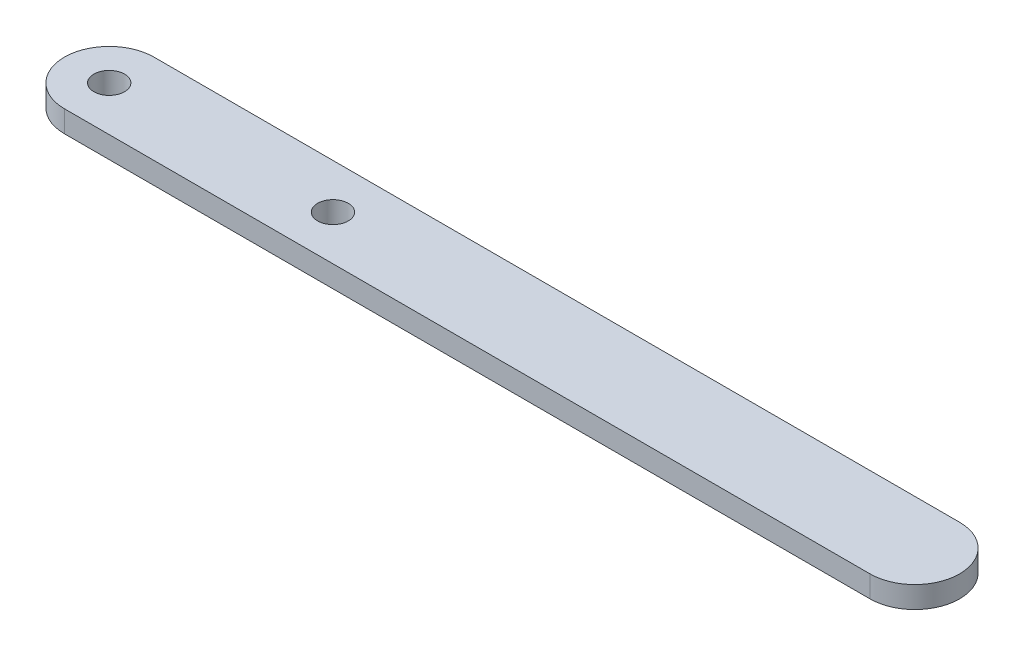
ISO-10303-21;
HEADER;
FILE_DESCRIPTION(('STEP AP214'),'2;1');
FILE_NAME('part.step','',(''),(''),'','','');
FILE_SCHEMA(('AUTOMOTIVE_DESIGN { 1 0 10303 214 1 1 1 1 }'));
ENDSEC;
DATA;
#1=APPLICATION_CONTEXT('core data for automotive mechanical design processes');
#2=APPLICATION_PROTOCOL_DEFINITION('international standard','automotive_design',2000,#1);
#3=PRODUCT_CONTEXT('',#1,'mechanical');
#4=PRODUCT('Part','Part','',(#3));
#5=PRODUCT_RELATED_PRODUCT_CATEGORY('part','',(#4));
#6=PRODUCT_DEFINITION_FORMATION('','',#4);
#7=PRODUCT_DEFINITION_CONTEXT('part definition',#1,'design');
#8=PRODUCT_DEFINITION('design','',#6,#7);
#9=PRODUCT_DEFINITION_SHAPE('','',#8);
#10=(LENGTH_UNIT() NAMED_UNIT(*) SI_UNIT(.MILLI.,.METRE.));
#11=(NAMED_UNIT(*) PLANE_ANGLE_UNIT() SI_UNIT($,.RADIAN.));
#12=(NAMED_UNIT(*) SI_UNIT($,.STERADIAN.) SOLID_ANGLE_UNIT());
#13=UNCERTAINTY_MEASURE_WITH_UNIT(LENGTH_MEASURE(1.E-05),#10,'distance_accuracy_value','');
#14=(GEOMETRIC_REPRESENTATION_CONTEXT(3) GLOBAL_UNCERTAINTY_ASSIGNED_CONTEXT((#13)) GLOBAL_UNIT_ASSIGNED_CONTEXT((#10,
#11,#12)) REPRESENTATION_CONTEXT('',''));
#15=CARTESIAN_POINT('',(0.,0.,0.));
#16=DIRECTION('',(0.,0.,1.));
#17=DIRECTION('',(1.,0.,0.));
#18=AXIS2_PLACEMENT_3D('',#15,#16,#17);
#19=CARTESIAN_POINT('',(-100.944661921708,3.075,-2.35017793594306));
#20=DIRECTION('',(0.,-1.,0.));
#21=DIRECTION('',(0.,0.,-1.));
#22=AXIS2_PLACEMENT_3D('',#19,#20,#21);
#23=CYLINDRICAL_SURFACE('',#22,6.35);
#24=CARTESIAN_POINT('',(-100.944661921708,0.,-2.35017793594306));
#25=DIRECTION('',(0.,1.,0.));
#26=DIRECTION('',(0.,0.,1.));
#27=AXIS2_PLACEMENT_3D('',#24,#25,#26);
#28=CIRCLE('',#27,6.35);
#29=CARTESIAN_POINT('',(-100.944661921708,0.,-8.70017793594306));
#30=VERTEX_POINT('',#29);
#31=CARTESIAN_POINT('',(-100.944661921708,0.,3.99982206405694));
#32=VERTEX_POINT('',#31);
#33=EDGE_CURVE('E113',#30,#32,#28,.T.);
#34=ORIENTED_EDGE('',*,*,#33,.T.);
#35=DIRECTION('',(0.,-1.,0.));
#36=VECTOR('',#35,1.);
#37=CARTESIAN_POINT('',(-100.944661921708,3.075,3.99982206405694));
#38=LINE('',#37,#36);
#39=CARTESIAN_POINT('',(-100.944661921708,3.075,3.99982206405694));
#40=VERTEX_POINT('',#39);
#41=EDGE_CURVE('E11',#40,#32,#38,.T.);
#42=ORIENTED_EDGE('',*,*,#41,.F.);
#43=CARTESIAN_POINT('',(-100.944661921708,3.075,-2.35017793594306));
#44=DIRECTION('',(0.,1.,0.));
#45=DIRECTION('',(0.,0.,1.));
#46=AXIS2_PLACEMENT_3D('',#43,#44,#45);
#47=CIRCLE('',#46,6.35);
#48=CARTESIAN_POINT('',(-100.944661921708,3.075,-8.70017793594306));
#49=VERTEX_POINT('',#48);
#50=EDGE_CURVE('E96',#49,#40,#47,.T.);
#51=ORIENTED_EDGE('',*,*,#50,.F.);
#52=DIRECTION('',(0.,-1.,0.));
#53=VECTOR('',#52,1.);
#54=CARTESIAN_POINT('',(-100.944661921708,3.075,-8.70017793594306));
#55=LINE('',#54,#53);
#56=EDGE_CURVE('E109',#49,#30,#55,.T.);
#57=ORIENTED_EDGE('',*,*,#56,.T.);
#58=EDGE_LOOP('',(#34,#42,#51,#57));
#59=FACE_BOUND('',#58,.T.);
#60=ADVANCED_FACE('F42',(#59),#23,.T.);
#61=CARTESIAN_POINT('',(-100.944661921708,3.075,3.99982206405694));
#62=DIRECTION('',(0.,0.,-1.));
#63=DIRECTION('',(-1.,0.,0.));
#64=AXIS2_PLACEMENT_3D('',#61,#62,#63);
#65=PLANE('',#64);
#66=DIRECTION('',(1.,0.,0.));
#67=VECTOR('',#66,1.);
#68=CARTESIAN_POINT('',(-100.944661921708,0.,3.99982206405694));
#69=LINE('',#68,#67);
#70=CARTESIAN_POINT('',(13.3553380782918,0.,3.99982206405694));
#71=VERTEX_POINT('',#70);
#72=EDGE_CURVE('E101',#32,#71,#69,.T.);
#73=ORIENTED_EDGE('',*,*,#72,.T.);
#74=DIRECTION('',(0.,-1.,0.));
#75=VECTOR('',#74,1.);
#76=CARTESIAN_POINT('',(13.3553380782918,3.075,3.99982206405694));
#77=LINE('',#76,#75);
#78=CARTESIAN_POINT('',(13.3553380782918,3.075,3.99982206405694));
#79=VERTEX_POINT('',#78);
#80=EDGE_CURVE('E52',#79,#71,#77,.T.);
#81=ORIENTED_EDGE('',*,*,#80,.F.);
#82=DIRECTION('',(1.,0.,0.));
#83=VECTOR('',#82,1.);
#84=CARTESIAN_POINT('',(-100.944661921708,3.075,3.99982206405694));
#85=LINE('',#84,#83);
#86=EDGE_CURVE('E91',#40,#79,#85,.T.);
#87=ORIENTED_EDGE('',*,*,#86,.F.);
#88=ORIENTED_EDGE('',*,*,#41,.T.);
#89=EDGE_LOOP('',(#73,#81,#87,#88));
#90=FACE_BOUND('',#89,.T.);
#91=ADVANCED_FACE('F100',(#90),#65,.F.);
#92=CARTESIAN_POINT('',(13.3553380782918,3.075,-2.35017793594306));
#93=DIRECTION('',(0.,-1.,0.));
#94=DIRECTION('',(0.,0.,-1.));
#95=AXIS2_PLACEMENT_3D('',#92,#93,#94);
#96=CYLINDRICAL_SURFACE('',#95,6.35);
#97=CARTESIAN_POINT('',(13.3553380782918,0.,-2.35017793594306));
#98=DIRECTION('',(0.,1.,0.));
#99=DIRECTION('',(0.,0.,-1.));
#100=AXIS2_PLACEMENT_3D('',#97,#98,#99);
#101=CIRCLE('',#100,6.35);
#102=CARTESIAN_POINT('',(13.3553380782918,0.,-8.70017793594306));
#103=VERTEX_POINT('',#102);
#104=EDGE_CURVE('E78',#71,#103,#101,.T.);
#105=ORIENTED_EDGE('',*,*,#104,.T.);
#106=DIRECTION('',(0.,-1.,0.));
#107=VECTOR('',#106,1.);
#108=CARTESIAN_POINT('',(13.3553380782918,3.075,-8.70017793594306));
#109=LINE('',#108,#107);
#110=CARTESIAN_POINT('',(13.3553380782918,3.075,-8.70017793594306));
#111=VERTEX_POINT('',#110);
#112=EDGE_CURVE('E103',#111,#103,#109,.T.);
#113=ORIENTED_EDGE('',*,*,#112,.F.);
#114=CARTESIAN_POINT('',(13.3553380782918,3.075,-2.35017793594306));
#115=DIRECTION('',(0.,1.,0.));
#116=DIRECTION('',(0.,0.,-1.));
#117=AXIS2_PLACEMENT_3D('',#114,#115,#116);
#118=CIRCLE('',#117,6.35);
#119=EDGE_CURVE('E94',#79,#111,#118,.T.);
#120=ORIENTED_EDGE('',*,*,#119,.F.);
#121=ORIENTED_EDGE('',*,*,#80,.T.);
#122=EDGE_LOOP('',(#105,#113,#120,#121));
#123=FACE_BOUND('',#122,.T.);
#124=ADVANCED_FACE('F105',(#123),#96,.T.);
#125=CARTESIAN_POINT('',(-100.944661921708,3.075,-8.70017793594306));
#126=DIRECTION('',(0.,0.,1.));
#127=DIRECTION('',(1.,0.,0.));
#128=AXIS2_PLACEMENT_3D('',#125,#126,#127);
#129=PLANE('',#128);
#130=DIRECTION('',(-1.,0.,0.));
#131=VECTOR('',#130,1.);
#132=CARTESIAN_POINT('',(-100.944661921708,0.,-8.70017793594306));
#133=LINE('',#132,#131);
#134=EDGE_CURVE('E84',#103,#30,#133,.T.);
#135=ORIENTED_EDGE('',*,*,#134,.T.);
#136=ORIENTED_EDGE('',*,*,#56,.F.);
#137=DIRECTION('',(-1.,0.,0.));
#138=VECTOR('',#137,1.);
#139=CARTESIAN_POINT('',(-100.944661921708,3.075,-8.70017793594306));
#140=LINE('',#139,#138);
#141=EDGE_CURVE('E61',#111,#49,#140,.T.);
#142=ORIENTED_EDGE('',*,*,#141,.F.);
#143=ORIENTED_EDGE('',*,*,#112,.T.);
#144=EDGE_LOOP('',(#135,#136,#142,#143));
#145=FACE_BOUND('',#144,.T.);
#146=ADVANCED_FACE('F151',(#145),#129,.F.);
#147=CARTESIAN_POINT('',(-100.944661921708,3.075,-2.35017793594306));
#148=DIRECTION('',(0.,1.,0.));
#149=DIRECTION('',(0.,0.,1.));
#150=AXIS2_PLACEMENT_3D('',#147,#148,#149);
#151=PLANE('',#150);
#152=CARTESIAN_POINT('',(-69.1946619217082,3.075,-2.35017793594306));
#153=DIRECTION('',(0.,1.,0.));
#154=DIRECTION('',(0.,0.,1.));
#155=AXIS2_PLACEMENT_3D('',#152,#153,#154);
#156=CIRCLE('',#155,2.175);
#157=CARTESIAN_POINT('',(-69.1946619217082,3.075,-0.17517793594306));
#158=VERTEX_POINT('',#157);
#159=EDGE_CURVE('E129',#158,#158,#156,.T.);
#160=ORIENTED_EDGE('',*,*,#159,.F.);
#161=EDGE_LOOP('',(#160));
#162=FACE_BOUND('',#161,.T.);
#163=CARTESIAN_POINT('',(-100.944661921708,3.075,-2.35017793594306));
#164=DIRECTION('',(0.,1.,0.));
#165=DIRECTION('',(0.,0.,1.));
#166=AXIS2_PLACEMENT_3D('',#163,#164,#165);
#167=CIRCLE('',#166,2.175);
#168=CARTESIAN_POINT('',(-100.944661921708,3.075,-0.17517793594306));
#169=VERTEX_POINT('',#168);
#170=EDGE_CURVE('E136',#169,#169,#167,.T.);
#171=ORIENTED_EDGE('',*,*,#170,.F.);
#172=EDGE_LOOP('',(#171));
#173=FACE_BOUND('',#172,.T.);
#174=ORIENTED_EDGE('',*,*,#50,.T.);
#175=ORIENTED_EDGE('',*,*,#86,.T.);
#176=ORIENTED_EDGE('',*,*,#119,.T.);
#177=ORIENTED_EDGE('',*,*,#141,.T.);
#178=EDGE_LOOP('',(#174,#175,#176,#177));
#179=FACE_BOUND('',#178,.T.);
#180=ADVANCED_FACE('F92',(#162,#173,#179),#151,.T.);
#181=CARTESIAN_POINT('',(-100.944661921708,0.,-2.35017793594306));
#182=DIRECTION('',(0.,1.,0.));
#183=DIRECTION('',(0.,0.,1.));
#184=AXIS2_PLACEMENT_3D('',#181,#182,#183);
#185=PLANE('',#184);
#186=CARTESIAN_POINT('',(-69.1946619217082,0.,-2.35017793594306));
#187=DIRECTION('',(0.,1.,0.));
#188=DIRECTION('',(0.,0.,1.));
#189=AXIS2_PLACEMENT_3D('',#186,#187,#188);
#190=CIRCLE('',#189,2.175);
#191=CARTESIAN_POINT('',(-69.1946619217082,0.,-0.17517793594306));
#192=VERTEX_POINT('',#191);
#193=EDGE_CURVE('E45',#192,#192,#190,.T.);
#194=ORIENTED_EDGE('',*,*,#193,.T.);
#195=EDGE_LOOP('',(#194));
#196=FACE_BOUND('',#195,.T.);
#197=CARTESIAN_POINT('',(-100.944661921708,0.,-2.35017793594306));
#198=DIRECTION('',(0.,1.,0.));
#199=DIRECTION('',(0.,0.,1.));
#200=AXIS2_PLACEMENT_3D('',#197,#198,#199);
#201=CIRCLE('',#200,2.175);
#202=CARTESIAN_POINT('',(-100.944661921708,0.,-0.17517793594306));
#203=VERTEX_POINT('',#202);
#204=EDGE_CURVE('E126',#203,#203,#201,.T.);
#205=ORIENTED_EDGE('',*,*,#204,.T.);
#206=EDGE_LOOP('',(#205));
#207=FACE_BOUND('',#206,.T.);
#208=ORIENTED_EDGE('',*,*,#33,.F.);
#209=ORIENTED_EDGE('',*,*,#134,.F.);
#210=ORIENTED_EDGE('',*,*,#104,.F.);
#211=ORIENTED_EDGE('',*,*,#72,.F.);
#212=EDGE_LOOP('',(#208,#209,#210,#211));
#213=FACE_BOUND('',#212,.T.);
#214=ADVANCED_FACE('F150',(#196,#207,#213),#185,.F.);
#215=CARTESIAN_POINT('',(-100.944661921708,-3.275,-2.35017793594306));
#216=DIRECTION('',(0.,1.,0.));
#217=DIRECTION('',(0.,0.,1.));
#218=AXIS2_PLACEMENT_3D('',#215,#216,#217);
#219=CYLINDRICAL_SURFACE('',#218,2.175);
#220=ORIENTED_EDGE('',*,*,#170,.T.);
#221=EDGE_LOOP('',(#220));
#222=FACE_BOUND('',#221,.T.);
#223=ORIENTED_EDGE('',*,*,#204,.F.);
#224=EDGE_LOOP('',(#223));
#225=FACE_BOUND('',#224,.T.);
#226=ADVANCED_FACE('F146',(#222,#225),#219,.F.);
#227=CARTESIAN_POINT('',(-69.1946619217082,-3.275,-2.35017793594306));
#228=DIRECTION('',(0.,1.,0.));
#229=DIRECTION('',(0.,0.,1.));
#230=AXIS2_PLACEMENT_3D('',#227,#228,#229);
#231=CYLINDRICAL_SURFACE('',#230,2.175);
#232=ORIENTED_EDGE('',*,*,#159,.T.);
#233=EDGE_LOOP('',(#232));
#234=FACE_BOUND('',#233,.T.);
#235=ORIENTED_EDGE('',*,*,#193,.F.);
#236=EDGE_LOOP('',(#235));
#237=FACE_BOUND('',#236,.T.);
#238=ADVANCED_FACE('F201',(#234,#237),#231,.F.);
#239=CLOSED_SHELL('',(#60,#91,#124,#146,#180,#214,#226,#238));
#240=MANIFOLD_SOLID_BREP('B2',#239);
#241=ADVANCED_BREP_SHAPE_REPRESENTATION('',(#18,#240),#14);
#242=SHAPE_DEFINITION_REPRESENTATION(#9,#241);
ENDSEC;
END-ISO-10303-21;
